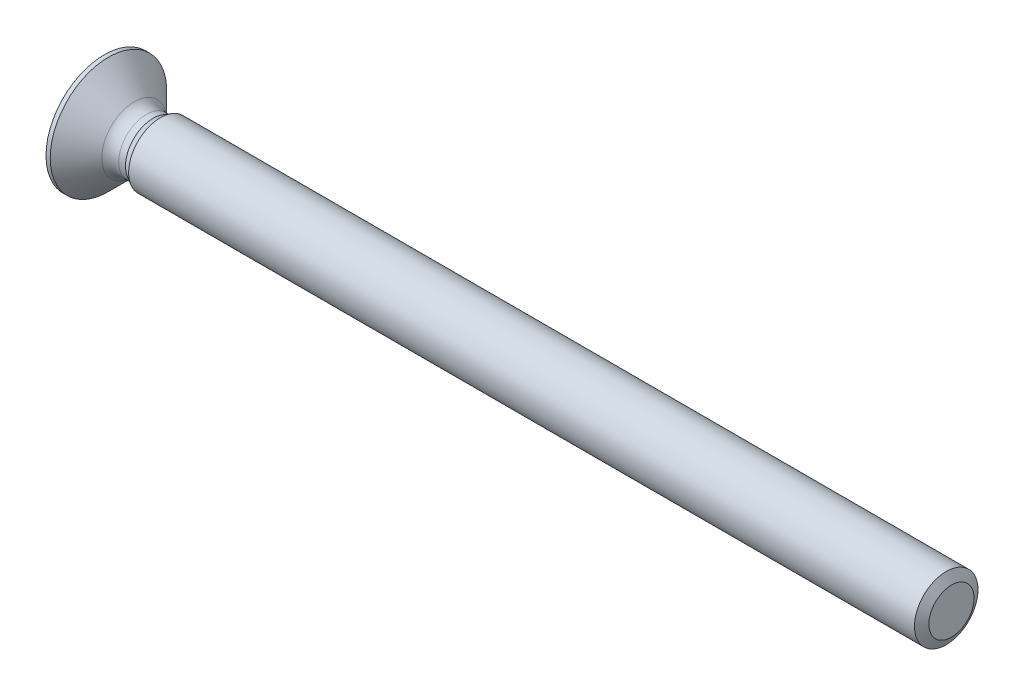
ISO-10303-21;
HEADER;
FILE_DESCRIPTION(('STEP AP214'),'2;1');
FILE_NAME('part.step','',(''),(''),'','','');
FILE_SCHEMA(('AUTOMOTIVE_DESIGN { 1 0 10303 214 1 1 1 1 }'));
ENDSEC;
DATA;
#1=APPLICATION_CONTEXT('core data for automotive mechanical design processes');
#2=APPLICATION_PROTOCOL_DEFINITION('international standard','automotive_design',2000,#1);
#3=PRODUCT_CONTEXT('',#1,'mechanical');
#4=PRODUCT('Part','Part','',(#3));
#5=PRODUCT_RELATED_PRODUCT_CATEGORY('part','',(#4));
#6=PRODUCT_DEFINITION_FORMATION('','',#4);
#7=PRODUCT_DEFINITION_CONTEXT('part definition',#1,'design');
#8=PRODUCT_DEFINITION('design','',#6,#7);
#9=PRODUCT_DEFINITION_SHAPE('','',#8);
#10=(LENGTH_UNIT() NAMED_UNIT(*) SI_UNIT(.MILLI.,.METRE.));
#11=(NAMED_UNIT(*) PLANE_ANGLE_UNIT() SI_UNIT($,.RADIAN.));
#12=(NAMED_UNIT(*) SI_UNIT($,.STERADIAN.) SOLID_ANGLE_UNIT());
#13=UNCERTAINTY_MEASURE_WITH_UNIT(LENGTH_MEASURE(1.E-05),#10,'distance_accuracy_value','');
#14=(GEOMETRIC_REPRESENTATION_CONTEXT(3) GLOBAL_UNCERTAINTY_ASSIGNED_CONTEXT((#13)) GLOBAL_UNIT_ASSIGNED_CONTEXT((#10,
#11,#12)) REPRESENTATION_CONTEXT('',''));
#15=CARTESIAN_POINT('',(0.,0.,0.));
#16=DIRECTION('',(0.,0.,1.));
#17=DIRECTION('',(1.,0.,0.));
#18=AXIS2_PLACEMENT_3D('',#15,#16,#17);
#19=CARTESIAN_POINT('',(0.,0.,0.));
#20=DIRECTION('',(1.,0.,0.));
#21=DIRECTION('',(0.,0.,-1.));
#22=AXIS2_PLACEMENT_3D('',#19,#20,#21);
#23=PLANE('',#22);
#24=CARTESIAN_POINT('',(0.,0.,0.));
#25=DIRECTION('',(-1.,0.,0.));
#26=DIRECTION('',(0.,0.,1.));
#27=AXIS2_PLACEMENT_3D('',#24,#25,#26);
#28=CIRCLE('',#27,2.75);
#29=CARTESIAN_POINT('',(0.,0.,2.75));
#30=VERTEX_POINT('',#29);
#31=EDGE_CURVE('E183',#30,#30,#28,.T.);
#32=ORIENTED_EDGE('',*,*,#31,.T.);
#33=EDGE_LOOP('',(#32));
#34=FACE_BOUND('',#33,.T.);
#35=DIRECTION('',(0.,1.,0.));
#36=VECTOR('',#35,1.);
#37=CARTESIAN_POINT('',(0.,1.6,0.250000000000006));
#38=LINE('',#37,#36);
#39=CARTESIAN_POINT('',(0.,0.25,0.250000000000001));
#40=VERTEX_POINT('',#39);
#41=CARTESIAN_POINT('',(0.,1.6,0.250000000000006));
#42=VERTEX_POINT('',#41);
#43=EDGE_CURVE('E105',#40,#42,#38,.T.);
#44=ORIENTED_EDGE('',*,*,#43,.F.);
#45=DIRECTION('',(0.,0.,-1.));
#46=VECTOR('',#45,1.);
#47=CARTESIAN_POINT('',(0.,0.25,-1.6));
#48=LINE('',#47,#46);
#49=CARTESIAN_POINT('',(0.,0.25,1.6));
#50=VERTEX_POINT('',#49);
#51=EDGE_CURVE('E150',#50,#40,#48,.T.);
#52=ORIENTED_EDGE('',*,*,#51,.F.);
#53=DIRECTION('',(0.,1.,0.));
#54=VECTOR('',#53,1.);
#55=CARTESIAN_POINT('',(0.,0.25,1.6));
#56=LINE('',#55,#54);
#57=CARTESIAN_POINT('',(0.,-0.25,1.6));
#58=VERTEX_POINT('',#57);
#59=EDGE_CURVE('E147',#58,#50,#56,.T.);
#60=ORIENTED_EDGE('',*,*,#59,.F.);
#61=DIRECTION('',(0.,0.,1.));
#62=VECTOR('',#61,1.);
#63=CARTESIAN_POINT('',(0.,-0.25,-1.6));
#64=LINE('',#63,#62);
#65=CARTESIAN_POINT('',(0.,-0.25,0.249999999999999));
#66=VERTEX_POINT('',#65);
#67=EDGE_CURVE('E78',#66,#58,#64,.T.);
#68=ORIENTED_EDGE('',*,*,#67,.F.);
#69=CARTESIAN_POINT('',(0.,-1.6,0.249999999999994));
#70=VERTEX_POINT('',#69);
#71=EDGE_CURVE('E113',#70,#66,#38,.T.);
#72=ORIENTED_EDGE('',*,*,#71,.F.);
#73=DIRECTION('',(0.,0.,1.));
#74=VECTOR('',#73,1.);
#75=CARTESIAN_POINT('',(0.,-1.6,0.249999999999994));
#76=LINE('',#75,#74);
#77=CARTESIAN_POINT('',(0.,-1.6,-0.250000000000006));
#78=VERTEX_POINT('',#77);
#79=EDGE_CURVE('E114',#78,#70,#76,.T.);
#80=ORIENTED_EDGE('',*,*,#79,.F.);
#81=DIRECTION('',(0.,-1.,0.));
#82=VECTOR('',#81,1.);
#83=CARTESIAN_POINT('',(0.,1.6,-0.249999999999994));
#84=LINE('',#83,#82);
#85=CARTESIAN_POINT('',(0.,-0.25,-0.250000000000001));
#86=VERTEX_POINT('',#85);
#87=EDGE_CURVE('E127',#86,#78,#84,.T.);
#88=ORIENTED_EDGE('',*,*,#87,.F.);
#89=CARTESIAN_POINT('',(0.,-0.25,-1.6));
#90=VERTEX_POINT('',#89);
#91=EDGE_CURVE('E144',#90,#86,#64,.T.);
#92=ORIENTED_EDGE('',*,*,#91,.F.);
#93=DIRECTION('',(0.,-1.,0.));
#94=VECTOR('',#93,1.);
#95=CARTESIAN_POINT('',(0.,0.25,-1.6));
#96=LINE('',#95,#94);
#97=CARTESIAN_POINT('',(0.,0.25,-1.6));
#98=VERTEX_POINT('',#97);
#99=EDGE_CURVE('E55',#98,#90,#96,.T.);
#100=ORIENTED_EDGE('',*,*,#99,.F.);
#101=CARTESIAN_POINT('',(0.,0.25,-0.249999999999999));
#102=VERTEX_POINT('',#101);
#103=EDGE_CURVE('E153',#102,#98,#48,.T.);
#104=ORIENTED_EDGE('',*,*,#103,.F.);
#105=CARTESIAN_POINT('',(0.,1.6,-0.249999999999994));
#106=VERTEX_POINT('',#105);
#107=EDGE_CURVE('E126',#106,#102,#84,.T.);
#108=ORIENTED_EDGE('',*,*,#107,.F.);
#109=DIRECTION('',(0.,0.,-1.));
#110=VECTOR('',#109,1.);
#111=CARTESIAN_POINT('',(0.,1.6,0.250000000000006));
#112=LINE('',#111,#110);
#113=EDGE_CURVE('E119',#42,#106,#112,.T.);
#114=ORIENTED_EDGE('',*,*,#113,.F.);
#115=EDGE_LOOP('',(#44,#52,#60,#68,#72,#80,#88,#92,#100,#104,#108,#114));
#116=FACE_BOUND('',#115,.T.);
#117=ADVANCED_FACE('F41',(#34,#116),#23,.F.);
#118=CARTESIAN_POINT('',(2.1,0.,0.));
#119=DIRECTION('',(-0.118212889785112,-0.992988274194944,0.));
#120=DIRECTION('',(0.992988274194944,-0.118212889785112,0.));
#121=AXIS2_PLACEMENT_3D('',#118,#119,#120);
#122=PLANE('',#121);
#123=ORIENTED_EDGE('',*,*,#51,.T.);
#124=DIRECTION('',(0.986122002690152,-0.117395476510732,-0.117395476510733));
#125=VECTOR('',#124,1.);
#126=CARTESIAN_POINT('',(2.1,0.,0.));
#127=LINE('',#126,#125);
#128=CARTESIAN_POINT('',(2.1,0.,0.));
#129=VERTEX_POINT('',#128);
#130=EDGE_CURVE('E84',#40,#129,#127,.T.);
#131=ORIENTED_EDGE('',*,*,#130,.T.);
#132=DIRECTION('',(0.791889207905293,-0.0942725247506301,-0.603344158404032));
#133=VECTOR('',#132,1.);
#134=CARTESIAN_POINT('',(0.,0.25,1.6));
#135=LINE('',#134,#133);
#136=EDGE_CURVE('E64',#50,#129,#135,.T.);
#137=ORIENTED_EDGE('',*,*,#136,.F.);
#138=EDGE_LOOP('',(#123,#131,#137));
#139=FACE_BOUND('',#138,.T.);
#140=ADVANCED_FACE('F199',(#139),#122,.T.);
#141=DIRECTION('',(0.791889207905293,-0.0942725247506301,0.603344158404032));
#142=VECTOR('',#141,1.);
#143=CARTESIAN_POINT('',(0.,0.25,-1.6));
#144=LINE('',#143,#142);
#145=EDGE_CURVE('E149',#98,#129,#144,.T.);
#146=ORIENTED_EDGE('',*,*,#145,.T.);
#147=DIRECTION('',(-0.986122002690152,0.117395476510732,-0.117395476510732));
#148=VECTOR('',#147,1.);
#149=CARTESIAN_POINT('',(2.1,0.,0.));
#150=LINE('',#149,#148);
#151=EDGE_CURVE('E131',#129,#102,#150,.T.);
#152=ORIENTED_EDGE('',*,*,#151,.T.);
#153=ORIENTED_EDGE('',*,*,#103,.T.);
#154=EDGE_LOOP('',(#146,#152,#153));
#155=FACE_BOUND('',#154,.T.);
#156=ADVANCED_FACE('F193',(#155),#122,.T.);
#157=CARTESIAN_POINT('',(2.1,0.,0.));
#158=DIRECTION('',(-0.118212889785112,0.992988274194944,0.));
#159=DIRECTION('',(-0.992988274194944,-0.118212889785112,0.));
#160=AXIS2_PLACEMENT_3D('',#157,#158,#159);
#161=PLANE('',#160);
#162=DIRECTION('',(0.791889207905293,0.0942725247506301,-0.603344158404032));
#163=VECTOR('',#162,1.);
#164=CARTESIAN_POINT('',(0.,-0.25,1.6));
#165=LINE('',#164,#163);
#166=EDGE_CURVE('E143',#58,#129,#165,.T.);
#167=ORIENTED_EDGE('',*,*,#166,.T.);
#168=DIRECTION('',(-0.986122002690152,-0.117395476510732,0.117395476510732));
#169=VECTOR('',#168,1.);
#170=CARTESIAN_POINT('',(2.1,0.,0.));
#171=LINE('',#170,#169);
#172=EDGE_CURVE('E11',#129,#66,#171,.T.);
#173=ORIENTED_EDGE('',*,*,#172,.T.);
#174=ORIENTED_EDGE('',*,*,#67,.T.);
#175=EDGE_LOOP('',(#167,#173,#174));
#176=FACE_BOUND('',#175,.T.);
#177=ADVANCED_FACE('F194',(#176),#161,.T.);
#178=ORIENTED_EDGE('',*,*,#91,.T.);
#179=DIRECTION('',(0.986122002690152,0.117395476510732,0.117395476510733));
#180=VECTOR('',#179,1.);
#181=CARTESIAN_POINT('',(2.1,0.,0.));
#182=LINE('',#181,#180);
#183=EDGE_CURVE('E48',#86,#129,#182,.T.);
#184=ORIENTED_EDGE('',*,*,#183,.T.);
#185=DIRECTION('',(0.791889207905293,0.0942725247506301,0.603344158404032));
#186=VECTOR('',#185,1.);
#187=CARTESIAN_POINT('',(0.,-0.25,-1.6));
#188=LINE('',#187,#186);
#189=EDGE_CURVE('E158',#90,#129,#188,.T.);
#190=ORIENTED_EDGE('',*,*,#189,.F.);
#191=EDGE_LOOP('',(#178,#184,#190));
#192=FACE_BOUND('',#191,.T.);
#193=ADVANCED_FACE('F187',(#192),#161,.T.);
#194=CARTESIAN_POINT('',(0.,0.,0.));
#195=DIRECTION('',(-1.,0.,0.));
#196=DIRECTION('',(0.,0.,1.));
#197=AXIS2_PLACEMENT_3D('',#194,#195,#196);
#198=CYLINDRICAL_SURFACE('',#197,2.75);
#199=ORIENTED_EDGE('',*,*,#31,.F.);
#200=EDGE_LOOP('',(#199));
#201=FACE_BOUND('',#200,.T.);
#202=CARTESIAN_POINT('',(0.199000000000005,0.,0.));
#203=DIRECTION('',(-1.,0.,0.));
#204=DIRECTION('',(0.,0.,1.));
#205=AXIS2_PLACEMENT_3D('',#202,#203,#204);
#206=CIRCLE('',#205,2.75);
#207=CARTESIAN_POINT('',(0.199000000000005,0.,2.75));
#208=VERTEX_POINT('',#207);
#209=EDGE_CURVE('E179',#208,#208,#206,.T.);
#210=ORIENTED_EDGE('',*,*,#209,.T.);
#211=EDGE_LOOP('',(#210));
#212=FACE_BOUND('',#211,.T.);
#213=ADVANCED_FACE('F227',(#201,#212),#198,.T.);
#214=CARTESIAN_POINT('',(1.41568542494924,0.,0.));
#215=DIRECTION('',(-1.,0.,0.));
#216=DIRECTION('',(0.,0.,1.));
#217=AXIS2_PLACEMENT_3D('',#214,#215,#216);
#218=CONICAL_SURFACE('',#217,1.53331457505076,0.78539816339745);
#219=ORIENTED_EDGE('',*,*,#209,.F.);
#220=EDGE_LOOP('',(#219));
#221=FACE_BOUND('',#220,.T.);
#222=CARTESIAN_POINT('',(1.41568542494924,0.,0.));
#223=DIRECTION('',(-1.,0.,0.));
#224=DIRECTION('',(0.,0.,1.));
#225=AXIS2_PLACEMENT_3D('',#222,#223,#224);
#226=CIRCLE('',#225,1.53331457505076);
#227=CARTESIAN_POINT('',(1.41568542494924,0.,1.53331457505076));
#228=VERTEX_POINT('',#227);
#229=EDGE_CURVE('E175',#228,#228,#226,.T.);
#230=ORIENTED_EDGE('',*,*,#229,.T.);
#231=EDGE_LOOP('',(#230));
#232=FACE_BOUND('',#231,.T.);
#233=ADVANCED_FACE('F230',(#221,#232),#218,.T.);
#234=CARTESIAN_POINT('',(1.98137084989848,0.,0.));
#235=DIRECTION('',(-1.,0.,0.));
#236=DIRECTION('',(0.,0.,1.));
#237=AXIS2_PLACEMENT_3D('',#234,#235,#236);
#238=TOROIDAL_SURFACE('',#237,2.099,0.8);
#239=ORIENTED_EDGE('',*,*,#229,.F.);
#240=EDGE_LOOP('',(#239));
#241=FACE_BOUND('',#240,.T.);
#242=CARTESIAN_POINT('',(1.98137084989848,0.,0.));
#243=DIRECTION('',(-1.,0.,0.));
#244=DIRECTION('',(0.,0.,1.));
#245=AXIS2_PLACEMENT_3D('',#242,#243,#244);
#246=CIRCLE('',#245,1.299);
#247=CARTESIAN_POINT('',(1.98137084989848,0.,1.299));
#248=VERTEX_POINT('',#247);
#249=EDGE_CURVE('E172',#248,#248,#246,.T.);
#250=ORIENTED_EDGE('',*,*,#249,.T.);
#251=EDGE_LOOP('',(#250));
#252=FACE_BOUND('',#251,.T.);
#253=ADVANCED_FACE('F235',(#241,#252),#238,.F.);
#254=CARTESIAN_POINT('',(0.,0.,0.));
#255=DIRECTION('',(-1.,0.,0.));
#256=DIRECTION('',(0.,0.,1.));
#257=AXIS2_PLACEMENT_3D('',#254,#255,#256);
#258=CYLINDRICAL_SURFACE('',#257,1.299);
#259=ORIENTED_EDGE('',*,*,#249,.F.);
#260=EDGE_LOOP('',(#259));
#261=FACE_BOUND('',#260,.T.);
#262=CARTESIAN_POINT('',(2.30185778767866,0.,0.));
#263=DIRECTION('',(-1.,0.,0.));
#264=DIRECTION('',(0.,0.,1.));
#265=AXIS2_PLACEMENT_3D('',#262,#263,#264);
#266=CIRCLE('',#265,1.299);
#267=CARTESIAN_POINT('',(2.30185778767866,0.,1.299));
#268=VERTEX_POINT('',#267);
#269=EDGE_CURVE('E169',#268,#268,#266,.T.);
#270=ORIENTED_EDGE('',*,*,#269,.T.);
#271=EDGE_LOOP('',(#270));
#272=FACE_BOUND('',#271,.T.);
#273=ADVANCED_FACE('F241',(#261,#272),#258,.T.);
#274=CARTESIAN_POINT('',(2.65,0.,0.));
#275=DIRECTION('',(1.,0.,0.));
#276=DIRECTION('',(0.,0.,-1.));
#277=AXIS2_PLACEMENT_3D('',#274,#275,#276);
#278=CONICAL_SURFACE('',#277,1.5,0.5235987755983);
#279=ORIENTED_EDGE('',*,*,#269,.F.);
#280=EDGE_LOOP('',(#279));
#281=FACE_BOUND('',#280,.T.);
#282=CARTESIAN_POINT('',(2.65,0.,0.));
#283=DIRECTION('',(-1.,0.,0.));
#284=DIRECTION('',(0.,0.,1.));
#285=AXIS2_PLACEMENT_3D('',#282,#283,#284);
#286=CIRCLE('',#285,1.5);
#287=CARTESIAN_POINT('',(2.65,0.,1.5));
#288=VERTEX_POINT('',#287);
#289=EDGE_CURVE('E166',#288,#288,#286,.T.);
#290=ORIENTED_EDGE('',*,*,#289,.T.);
#291=EDGE_LOOP('',(#290));
#292=FACE_BOUND('',#291,.T.);
#293=ADVANCED_FACE('F247',(#281,#292),#278,.T.);
#294=CARTESIAN_POINT('',(0.,0.,0.));
#295=DIRECTION('',(-1.,0.,0.));
#296=DIRECTION('',(0.,0.,1.));
#297=AXIS2_PLACEMENT_3D('',#294,#295,#296);
#298=CYLINDRICAL_SURFACE('',#297,1.5);
#299=CARTESIAN_POINT('',(39.7527080028712,0.,0.));
#300=DIRECTION('',(1.,0.,0.));
#301=DIRECTION('',(0.,0.,-1.));
#302=AXIS2_PLACEMENT_3D('',#299,#300,#301);
#303=CIRCLE('',#302,1.5);
#304=CARTESIAN_POINT('',(39.7527080028712,0.,-1.5));
#305=VERTEX_POINT('',#304);
#306=EDGE_CURVE('E163',#305,#305,#303,.T.);
#307=ORIENTED_EDGE('',*,*,#306,.F.);
#308=EDGE_LOOP('',(#307));
#309=FACE_BOUND('',#308,.T.);
#310=ORIENTED_EDGE('',*,*,#289,.F.);
#311=EDGE_LOOP('',(#310));
#312=FACE_BOUND('',#311,.T.);
#313=ADVANCED_FACE('F253',(#309,#312),#298,.T.);
#314=CARTESIAN_POINT('',(39.7527080028712,0.,0.));
#315=DIRECTION('',(-1.,0.,0.));
#316=DIRECTION('',(0.,0.,1.));
#317=AXIS2_PLACEMENT_3D('',#314,#315,#316);
#318=CONICAL_SURFACE('',#317,1.5,1.05188801855135);
#319=CARTESIAN_POINT('',(40.,0.,0.));
#320=DIRECTION('',(1.,0.,0.));
#321=DIRECTION('',(0.,0.,-1.));
#322=AXIS2_PLACEMENT_3D('',#319,#320,#321);
#323=CIRCLE('',#322,1.067);
#324=CARTESIAN_POINT('',(40.,0.,-1.067));
#325=VERTEX_POINT('',#324);
#326=EDGE_CURVE('E152',#325,#325,#323,.T.);
#327=ORIENTED_EDGE('',*,*,#326,.F.);
#328=EDGE_LOOP('',(#327));
#329=FACE_BOUND('',#328,.T.);
#330=ORIENTED_EDGE('',*,*,#306,.T.);
#331=EDGE_LOOP('',(#330));
#332=FACE_BOUND('',#331,.T.);
#333=ADVANCED_FACE('F258',(#329,#332),#318,.T.);
#334=CARTESIAN_POINT('',(40.,1.5,0.));
#335=DIRECTION('',(-1.,0.,0.));
#336=DIRECTION('',(0.,0.,1.));
#337=AXIS2_PLACEMENT_3D('',#334,#335,#336);
#338=PLANE('',#337);
#339=ORIENTED_EDGE('',*,*,#326,.T.);
#340=EDGE_LOOP('',(#339));
#341=FACE_BOUND('',#340,.T.);
#342=ADVANCED_FACE('F264',(#341),#338,.F.);
#343=CARTESIAN_POINT('',(0.,0.25,-1.6));
#344=DIRECTION('',(0.606043215262856,0.,-0.795431720032499));
#345=DIRECTION('',(-0.795431720032499,0.,-0.606043215262856));
#346=AXIS2_PLACEMENT_3D('',#343,#344,#345);
#347=PLANE('',#346);
#348=ORIENTED_EDGE('',*,*,#145,.F.);
#349=ORIENTED_EDGE('',*,*,#99,.T.);
#350=ORIENTED_EDGE('',*,*,#189,.T.);
#351=EDGE_LOOP('',(#348,#349,#350));
#352=FACE_BOUND('',#351,.T.);
#353=ADVANCED_FACE('F191',(#352),#347,.F.);
#354=CARTESIAN_POINT('',(0.,-0.25,1.6));
#355=DIRECTION('',(0.606043215262856,0.,0.795431720032499));
#356=DIRECTION('',(0.795431720032499,0.,-0.606043215262856));
#357=AXIS2_PLACEMENT_3D('',#354,#355,#356);
#358=PLANE('',#357);
#359=ORIENTED_EDGE('',*,*,#166,.F.);
#360=ORIENTED_EDGE('',*,*,#59,.T.);
#361=ORIENTED_EDGE('',*,*,#136,.T.);
#362=EDGE_LOOP('',(#359,#360,#361));
#363=FACE_BOUND('',#362,.T.);
#364=ADVANCED_FACE('F198',(#363),#358,.F.);
#365=CARTESIAN_POINT('',(2.1,0.,0.));
#366=DIRECTION('',(-0.118212889785112,0.,-0.992988274194944));
#367=DIRECTION('',(0.992988274194944,0.,-0.118212889785112));
#368=AXIS2_PLACEMENT_3D('',#365,#366,#367);
#369=PLANE('',#368);
#370=DIRECTION('',(0.791889207905293,0.603344158404033,-0.0942725247506279));
#371=VECTOR('',#370,1.);
#372=CARTESIAN_POINT('',(0.,-1.6,0.249999999999994));
#373=LINE('',#372,#371);
#374=EDGE_CURVE('E123',#70,#129,#373,.T.);
#375=ORIENTED_EDGE('',*,*,#374,.F.);
#376=ORIENTED_EDGE('',*,*,#71,.T.);
#377=ORIENTED_EDGE('',*,*,#172,.F.);
#378=EDGE_LOOP('',(#375,#376,#377));
#379=FACE_BOUND('',#378,.T.);
#380=ADVANCED_FACE('F203',(#379),#369,.T.);
#381=CARTESIAN_POINT('',(2.1,0.,0.));
#382=DIRECTION('',(-0.118212889785112,0.,0.992988274194944));
#383=DIRECTION('',(-0.992988274194944,0.,-0.118212889785112));
#384=AXIS2_PLACEMENT_3D('',#381,#382,#383);
#385=PLANE('',#384);
#386=ORIENTED_EDGE('',*,*,#87,.T.);
#387=DIRECTION('',(0.791889207905293,0.603344158404032,0.0942725247506322));
#388=VECTOR('',#387,1.);
#389=CARTESIAN_POINT('',(0.,-1.6,-0.250000000000006));
#390=LINE('',#389,#388);
#391=EDGE_CURVE('E137',#78,#129,#390,.T.);
#392=ORIENTED_EDGE('',*,*,#391,.T.);
#393=ORIENTED_EDGE('',*,*,#183,.F.);
#394=EDGE_LOOP('',(#386,#392,#393));
#395=FACE_BOUND('',#394,.T.);
#396=ADVANCED_FACE('F207',(#395),#385,.T.);
#397=CARTESIAN_POINT('',(0.,-1.6,-0.250000000000006));
#398=DIRECTION('',(0.606043215262856,-0.795431720032499,0.));
#399=DIRECTION('',(0.795431720032499,0.606043215262856,0.));
#400=AXIS2_PLACEMENT_3D('',#397,#398,#399);
#401=PLANE('',#400);
#402=ORIENTED_EDGE('',*,*,#391,.F.);
#403=ORIENTED_EDGE('',*,*,#79,.T.);
#404=ORIENTED_EDGE('',*,*,#374,.T.);
#405=EDGE_LOOP('',(#402,#403,#404));
#406=FACE_BOUND('',#405,.T.);
#407=ADVANCED_FACE('F206',(#406),#401,.F.);
#408=ORIENTED_EDGE('',*,*,#43,.T.);
#409=DIRECTION('',(0.791889207905293,-0.603344158404032,-0.0942725247506322));
#410=VECTOR('',#409,1.);
#411=CARTESIAN_POINT('',(0.,1.6,0.250000000000006));
#412=LINE('',#411,#410);
#413=EDGE_CURVE('E108',#42,#129,#412,.T.);
#414=ORIENTED_EDGE('',*,*,#413,.T.);
#415=ORIENTED_EDGE('',*,*,#130,.F.);
#416=EDGE_LOOP('',(#408,#414,#415));
#417=FACE_BOUND('',#416,.T.);
#418=ADVANCED_FACE('F107',(#417),#369,.T.);
#419=DIRECTION('',(0.791889207905293,-0.603344158404033,0.0942725247506279));
#420=VECTOR('',#419,1.);
#421=CARTESIAN_POINT('',(0.,1.6,-0.249999999999994));
#422=LINE('',#421,#420);
#423=EDGE_CURVE('E121',#106,#129,#422,.T.);
#424=ORIENTED_EDGE('',*,*,#423,.F.);
#425=ORIENTED_EDGE('',*,*,#107,.T.);
#426=ORIENTED_EDGE('',*,*,#151,.F.);
#427=EDGE_LOOP('',(#424,#425,#426));
#428=FACE_BOUND('',#427,.T.);
#429=ADVANCED_FACE('F210',(#428),#385,.T.);
#430=CARTESIAN_POINT('',(0.,1.6,0.250000000000006));
#431=DIRECTION('',(0.606043215262856,0.795431720032499,0.));
#432=DIRECTION('',(-0.795431720032499,0.606043215262856,0.));
#433=AXIS2_PLACEMENT_3D('',#430,#431,#432);
#434=PLANE('',#433);
#435=ORIENTED_EDGE('',*,*,#413,.F.);
#436=ORIENTED_EDGE('',*,*,#113,.T.);
#437=ORIENTED_EDGE('',*,*,#423,.T.);
#438=EDGE_LOOP('',(#435,#436,#437));
#439=FACE_BOUND('',#438,.T.);
#440=ADVANCED_FACE('F118',(#439),#434,.F.);
#441=CLOSED_SHELL('',(#117,#140,#156,#177,#193,#213,#233,#253,#273,#293,#313,#333,#342,#353,
#364,#380,#396,#407,#418,#429,#440));
#442=MANIFOLD_SOLID_BREP('B2',#441);
#443=ADVANCED_BREP_SHAPE_REPRESENTATION('',(#18,#442),#14);
#444=SHAPE_DEFINITION_REPRESENTATION(#9,#443);
ENDSEC;
END-ISO-10303-21;
